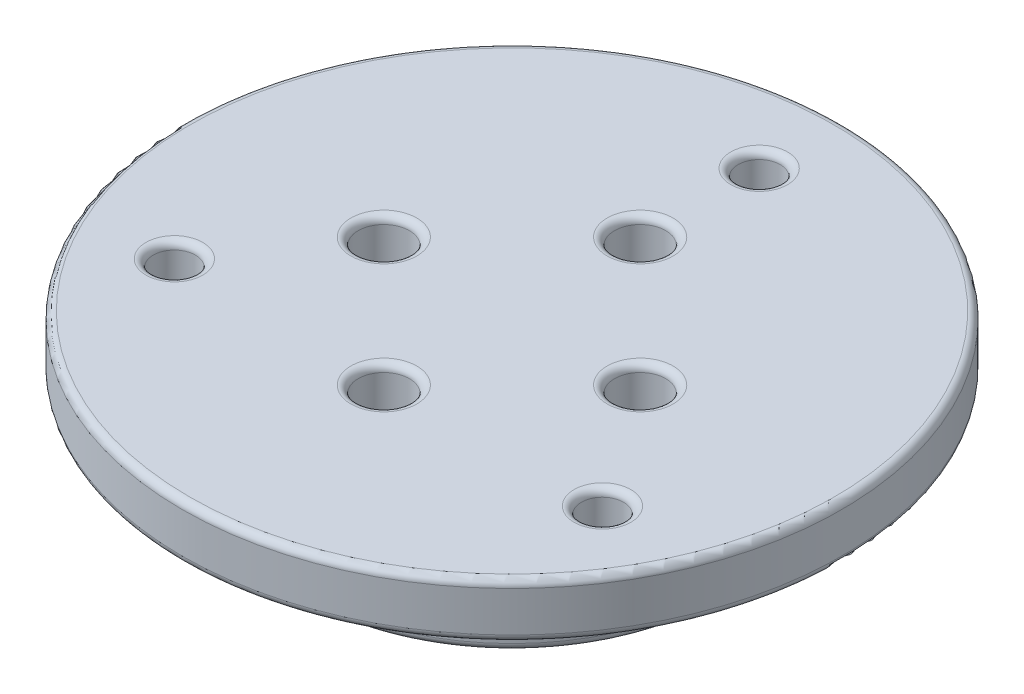
ISO-10303-21;
HEADER;
FILE_DESCRIPTION(('STEP AP214'),'2;1');
FILE_NAME('part.step','',(''),(''),'','','');
FILE_SCHEMA(('AUTOMOTIVE_DESIGN { 1 0 10303 214 1 1 1 1 }'));
ENDSEC;
DATA;
#1=APPLICATION_CONTEXT('core data for automotive mechanical design processes');
#2=APPLICATION_PROTOCOL_DEFINITION('international standard','automotive_design',2000,#1);
#3=PRODUCT_CONTEXT('',#1,'mechanical');
#4=PRODUCT('Part','Part','',(#3));
#5=PRODUCT_RELATED_PRODUCT_CATEGORY('part','',(#4));
#6=PRODUCT_DEFINITION_FORMATION('','',#4);
#7=PRODUCT_DEFINITION_CONTEXT('part definition',#1,'design');
#8=PRODUCT_DEFINITION('design','',#6,#7);
#9=PRODUCT_DEFINITION_SHAPE('','',#8);
#10=(LENGTH_UNIT() NAMED_UNIT(*) SI_UNIT(.MILLI.,.METRE.));
#11=(NAMED_UNIT(*) PLANE_ANGLE_UNIT() SI_UNIT($,.RADIAN.));
#12=(NAMED_UNIT(*) SI_UNIT($,.STERADIAN.) SOLID_ANGLE_UNIT());
#13=UNCERTAINTY_MEASURE_WITH_UNIT(LENGTH_MEASURE(1.E-05),#10,'distance_accuracy_value','');
#14=(GEOMETRIC_REPRESENTATION_CONTEXT(3) GLOBAL_UNCERTAINTY_ASSIGNED_CONTEXT((#13)) GLOBAL_UNIT_ASSIGNED_CONTEXT((#10,
#11,#12)) REPRESENTATION_CONTEXT('',''));
#15=CARTESIAN_POINT('',(0.,0.,0.));
#16=DIRECTION('',(0.,0.,1.));
#17=DIRECTION('',(1.,0.,0.));
#18=AXIS2_PLACEMENT_3D('',#15,#16,#17);
#19=CARTESIAN_POINT('',(0.,0.,0.));
#20=DIRECTION('',(0.,-1.,0.));
#21=DIRECTION('',(0.,0.,-1.));
#22=AXIS2_PLACEMENT_3D('',#19,#20,#21);
#23=PLANE('',#22);
#24=CARTESIAN_POINT('',(0.,0.,0.));
#25=DIRECTION('',(0.,-1.,0.));
#26=DIRECTION('',(0.,0.,-1.));
#27=AXIS2_PLACEMENT_3D('',#24,#25,#26);
#28=CIRCLE('',#27,11.1);
#29=CARTESIAN_POINT('',(0.,0.,-11.1));
#30=VERTEX_POINT('',#29);
#31=EDGE_CURVE('E136',#30,#30,#28,.T.);
#32=ORIENTED_EDGE('',*,*,#31,.T.);
#33=EDGE_LOOP('',(#32));
#34=FACE_BOUND('',#33,.T.);
#35=CARTESIAN_POINT('',(7.,0.,0.));
#36=DIRECTION('',(0.,-1.,0.));
#37=DIRECTION('',(0.,0.,-1.));
#38=AXIS2_PLACEMENT_3D('',#35,#36,#37);
#39=CIRCLE('',#38,1.8);
#40=CARTESIAN_POINT('',(7.,0.,-1.8));
#41=VERTEX_POINT('',#40);
#42=EDGE_CURVE('E139',#41,#41,#39,.F.);
#43=ORIENTED_EDGE('',*,*,#42,.T.);
#44=EDGE_LOOP('',(#43));
#45=FACE_BOUND('',#44,.T.);
#46=CARTESIAN_POINT('',(0.,0.,-7.));
#47=DIRECTION('',(0.,-1.,0.));
#48=DIRECTION('',(0.,0.,-1.));
#49=AXIS2_PLACEMENT_3D('',#46,#47,#48);
#50=CIRCLE('',#49,1.8);
#51=CARTESIAN_POINT('',(0.,0.,-8.8));
#52=VERTEX_POINT('',#51);
#53=EDGE_CURVE('E142',#52,#52,#50,.F.);
#54=ORIENTED_EDGE('',*,*,#53,.T.);
#55=EDGE_LOOP('',(#54));
#56=FACE_BOUND('',#55,.T.);
#57=CARTESIAN_POINT('',(0.,0.,7.));
#58=DIRECTION('',(0.,-1.,0.));
#59=DIRECTION('',(0.,0.,-1.));
#60=AXIS2_PLACEMENT_3D('',#57,#58,#59);
#61=CIRCLE('',#60,1.8);
#62=CARTESIAN_POINT('',(0.,0.,5.2));
#63=VERTEX_POINT('',#62);
#64=EDGE_CURVE('E145',#63,#63,#61,.F.);
#65=ORIENTED_EDGE('',*,*,#64,.T.);
#66=EDGE_LOOP('',(#65));
#67=FACE_BOUND('',#66,.T.);
#68=CARTESIAN_POINT('',(-7.,0.,0.));
#69=DIRECTION('',(0.,-1.,0.));
#70=DIRECTION('',(0.,0.,-1.));
#71=AXIS2_PLACEMENT_3D('',#68,#69,#70);
#72=CIRCLE('',#71,1.8);
#73=CARTESIAN_POINT('',(-7.,0.,-1.8));
#74=VERTEX_POINT('',#73);
#75=EDGE_CURVE('E148',#74,#74,#72,.F.);
#76=ORIENTED_EDGE('',*,*,#75,.T.);
#77=EDGE_LOOP('',(#76));
#78=FACE_BOUND('',#77,.T.);
#79=ADVANCED_FACE('F35',(#34,#45,#56,#67,#78),#23,.T.);
#80=CARTESIAN_POINT('',(0.,0.,0.));
#81=DIRECTION('',(0.,-1.,0.));
#82=DIRECTION('',(0.,0.,-1.));
#83=AXIS2_PLACEMENT_3D('',#80,#81,#82);
#84=CYLINDRICAL_SURFACE('',#83,11.5);
#85=CARTESIAN_POINT('',(0.,0.4,0.));
#86=DIRECTION('',(0.,-1.,0.));
#87=DIRECTION('',(0.,0.,-1.));
#88=AXIS2_PLACEMENT_3D('',#85,#86,#87);
#89=CIRCLE('',#88,11.5);
#90=CARTESIAN_POINT('',(0.,0.4,-11.5));
#91=VERTEX_POINT('',#90);
#92=EDGE_CURVE('E130',#91,#91,#89,.F.);
#93=ORIENTED_EDGE('',*,*,#92,.T.);
#94=EDGE_LOOP('',(#93));
#95=FACE_BOUND('',#94,.T.);
#96=CARTESIAN_POINT('',(0.,4.6,0.));
#97=DIRECTION('',(0.,-1.,0.));
#98=DIRECTION('',(0.,0.,-1.));
#99=AXIS2_PLACEMENT_3D('',#96,#97,#98);
#100=CIRCLE('',#99,11.5);
#101=CARTESIAN_POINT('',(0.,4.6,-11.5));
#102=VERTEX_POINT('',#101);
#103=EDGE_CURVE('E133',#102,#102,#100,.T.);
#104=ORIENTED_EDGE('',*,*,#103,.T.);
#105=EDGE_LOOP('',(#104));
#106=FACE_BOUND('',#105,.T.);
#107=ADVANCED_FACE('F171',(#95,#106),#84,.T.);
#108=CARTESIAN_POINT('',(11.5,5.,0.));
#109=DIRECTION('',(0.,-1.,0.));
#110=DIRECTION('',(0.,0.,-1.));
#111=AXIS2_PLACEMENT_3D('',#108,#109,#110);
#112=PLANE('',#111);
#113=CARTESIAN_POINT('',(0.,5.,0.));
#114=DIRECTION('',(0.,-1.,0.));
#115=DIRECTION('',(0.,0.,-1.));
#116=AXIS2_PLACEMENT_3D('',#113,#114,#115);
#117=CIRCLE('',#116,11.9);
#118=CARTESIAN_POINT('',(0.,5.,-11.9));
#119=VERTEX_POINT('',#118);
#120=EDGE_CURVE('E91',#119,#119,#117,.F.);
#121=ORIENTED_EDGE('',*,*,#120,.T.);
#122=EDGE_LOOP('',(#121));
#123=FACE_BOUND('',#122,.T.);
#124=CARTESIAN_POINT('',(0.,5.,0.));
#125=DIRECTION('',(0.,-1.,0.));
#126=DIRECTION('',(0.,0.,-1.));
#127=AXIS2_PLACEMENT_3D('',#124,#125,#126);
#128=CIRCLE('',#127,17.6);
#129=CARTESIAN_POINT('',(0.,5.,-17.6));
#130=VERTEX_POINT('',#129);
#131=EDGE_CURVE('E94',#130,#130,#128,.T.);
#132=ORIENTED_EDGE('',*,*,#131,.T.);
#133=EDGE_LOOP('',(#132));
#134=FACE_BOUND('',#133,.T.);
#135=CARTESIAN_POINT('',(-11.6913429510899,5.,6.75000000000001));
#136=DIRECTION('',(0.,-1.,0.));
#137=DIRECTION('',(0.,0.,-1.));
#138=AXIS2_PLACEMENT_3D('',#135,#136,#137);
#139=CIRCLE('',#138,1.55);
#140=CARTESIAN_POINT('',(-11.6913429510899,5.,5.20000000000001));
#141=VERTEX_POINT('',#140);
#142=EDGE_CURVE('E97',#141,#141,#139,.F.);
#143=ORIENTED_EDGE('',*,*,#142,.T.);
#144=EDGE_LOOP('',(#143));
#145=FACE_BOUND('',#144,.T.);
#146=CARTESIAN_POINT('',(11.6913429510899,5.,6.75));
#147=DIRECTION('',(0.,-1.,0.));
#148=DIRECTION('',(0.,0.,-1.));
#149=AXIS2_PLACEMENT_3D('',#146,#147,#148);
#150=CIRCLE('',#149,1.55);
#151=CARTESIAN_POINT('',(11.6913429510899,5.,5.2));
#152=VERTEX_POINT('',#151);
#153=EDGE_CURVE('E100',#152,#152,#150,.F.);
#154=ORIENTED_EDGE('',*,*,#153,.T.);
#155=EDGE_LOOP('',(#154));
#156=FACE_BOUND('',#155,.T.);
#157=CARTESIAN_POINT('',(0.,5.,-13.5));
#158=DIRECTION('',(0.,-1.,0.));
#159=DIRECTION('',(0.,0.,-1.));
#160=AXIS2_PLACEMENT_3D('',#157,#158,#159);
#161=CIRCLE('',#160,1.55);
#162=CARTESIAN_POINT('',(0.,5.,-15.05));
#163=VERTEX_POINT('',#162);
#164=EDGE_CURVE('E103',#163,#163,#161,.F.);
#165=ORIENTED_EDGE('',*,*,#164,.T.);
#166=EDGE_LOOP('',(#165));
#167=FACE_BOUND('',#166,.T.);
#168=ADVANCED_FACE('F177',(#123,#134,#145,#156,#167),#112,.T.);
#169=CARTESIAN_POINT('',(0.,0.,0.));
#170=DIRECTION('',(0.,-1.,0.));
#171=DIRECTION('',(0.,0.,-1.));
#172=AXIS2_PLACEMENT_3D('',#169,#170,#171);
#173=CYLINDRICAL_SURFACE('',#172,18.);
#174=CARTESIAN_POINT('',(0.,5.4,0.));
#175=DIRECTION('',(0.,-1.,0.));
#176=DIRECTION('',(0.,0.,-1.));
#177=AXIS2_PLACEMENT_3D('',#174,#175,#176);
#178=CIRCLE('',#177,18.);
#179=CARTESIAN_POINT('',(0.,5.4,-18.));
#180=VERTEX_POINT('',#179);
#181=EDGE_CURVE('E85',#180,#180,#178,.F.);
#182=ORIENTED_EDGE('',*,*,#181,.T.);
#183=EDGE_LOOP('',(#182));
#184=FACE_BOUND('',#183,.T.);
#185=CARTESIAN_POINT('',(0.,7.6,0.));
#186=DIRECTION('',(0.,1.,0.));
#187=DIRECTION('',(0.,0.,1.));
#188=AXIS2_PLACEMENT_3D('',#185,#186,#187);
#189=CIRCLE('',#188,18.);
#190=CARTESIAN_POINT('',(0.,7.6,18.));
#191=VERTEX_POINT('',#190);
#192=EDGE_CURVE('E88',#191,#191,#189,.F.);
#193=ORIENTED_EDGE('',*,*,#192,.T.);
#194=EDGE_LOOP('',(#193));
#195=FACE_BOUND('',#194,.T.);
#196=ADVANCED_FACE('F267',(#184,#195),#173,.T.);
#197=CARTESIAN_POINT('',(18.,8.,0.));
#198=DIRECTION('',(0.,1.,0.));
#199=DIRECTION('',(0.,0.,1.));
#200=AXIS2_PLACEMENT_3D('',#197,#198,#199);
#201=PLANE('',#200);
#202=CARTESIAN_POINT('',(0.,8.,0.));
#203=DIRECTION('',(0.,1.,0.));
#204=DIRECTION('',(0.,0.,1.));
#205=AXIS2_PLACEMENT_3D('',#202,#203,#204);
#206=CIRCLE('',#205,17.6);
#207=CARTESIAN_POINT('',(0.,8.,17.6));
#208=VERTEX_POINT('',#207);
#209=EDGE_CURVE('E10',#208,#208,#206,.T.);
#210=ORIENTED_EDGE('',*,*,#209,.T.);
#211=EDGE_LOOP('',(#210));
#212=FACE_BOUND('',#211,.T.);
#213=CARTESIAN_POINT('',(7.,8.,0.));
#214=DIRECTION('',(0.,1.,0.));
#215=DIRECTION('',(0.,0.,1.));
#216=AXIS2_PLACEMENT_3D('',#213,#214,#215);
#217=CIRCLE('',#216,1.8);
#218=CARTESIAN_POINT('',(7.,8.,1.8));
#219=VERTEX_POINT('',#218);
#220=EDGE_CURVE('E42',#219,#219,#217,.F.);
#221=ORIENTED_EDGE('',*,*,#220,.T.);
#222=EDGE_LOOP('',(#221));
#223=FACE_BOUND('',#222,.T.);
#224=CARTESIAN_POINT('',(-11.6913429510899,8.,6.75000000000001));
#225=DIRECTION('',(0.,1.,0.));
#226=DIRECTION('',(0.,0.,1.));
#227=AXIS2_PLACEMENT_3D('',#224,#225,#226);
#228=CIRCLE('',#227,1.55);
#229=CARTESIAN_POINT('',(-11.6913429510899,8.,8.30000000000001));
#230=VERTEX_POINT('',#229);
#231=EDGE_CURVE('E46',#230,#230,#228,.F.);
#232=ORIENTED_EDGE('',*,*,#231,.T.);
#233=EDGE_LOOP('',(#232));
#234=FACE_BOUND('',#233,.T.);
#235=CARTESIAN_POINT('',(11.6913429510899,8.,6.75));
#236=DIRECTION('',(0.,1.,0.));
#237=DIRECTION('',(0.,0.,1.));
#238=AXIS2_PLACEMENT_3D('',#235,#236,#237);
#239=CIRCLE('',#238,1.55);
#240=CARTESIAN_POINT('',(11.6913429510899,8.,8.3));
#241=VERTEX_POINT('',#240);
#242=EDGE_CURVE('E50',#241,#241,#239,.F.);
#243=ORIENTED_EDGE('',*,*,#242,.T.);
#244=EDGE_LOOP('',(#243));
#245=FACE_BOUND('',#244,.T.);
#246=CARTESIAN_POINT('',(0.,8.,-7.));
#247=DIRECTION('',(0.,1.,0.));
#248=DIRECTION('',(0.,0.,1.));
#249=AXIS2_PLACEMENT_3D('',#246,#247,#248);
#250=CIRCLE('',#249,1.8);
#251=CARTESIAN_POINT('',(0.,8.,-5.2));
#252=VERTEX_POINT('',#251);
#253=EDGE_CURVE('E55',#252,#252,#250,.F.);
#254=ORIENTED_EDGE('',*,*,#253,.T.);
#255=EDGE_LOOP('',(#254));
#256=FACE_BOUND('',#255,.T.);
#257=CARTESIAN_POINT('',(0.,8.,7.));
#258=DIRECTION('',(0.,1.,0.));
#259=DIRECTION('',(0.,0.,1.));
#260=AXIS2_PLACEMENT_3D('',#257,#258,#259);
#261=CIRCLE('',#260,1.8);
#262=CARTESIAN_POINT('',(0.,8.,8.8));
#263=VERTEX_POINT('',#262);
#264=EDGE_CURVE('E58',#263,#263,#261,.F.);
#265=ORIENTED_EDGE('',*,*,#264,.T.);
#266=EDGE_LOOP('',(#265));
#267=FACE_BOUND('',#266,.T.);
#268=CARTESIAN_POINT('',(-7.,8.,0.));
#269=DIRECTION('',(0.,1.,0.));
#270=DIRECTION('',(0.,0.,1.));
#271=AXIS2_PLACEMENT_3D('',#268,#269,#270);
#272=CIRCLE('',#271,1.8);
#273=CARTESIAN_POINT('',(-7.,8.,1.8));
#274=VERTEX_POINT('',#273);
#275=EDGE_CURVE('E61',#274,#274,#272,.F.);
#276=ORIENTED_EDGE('',*,*,#275,.T.);
#277=EDGE_LOOP('',(#276));
#278=FACE_BOUND('',#277,.T.);
#279=CARTESIAN_POINT('',(0.,8.,-13.5));
#280=DIRECTION('',(0.,1.,0.));
#281=DIRECTION('',(0.,0.,1.));
#282=AXIS2_PLACEMENT_3D('',#279,#280,#281);
#283=CIRCLE('',#282,1.55);
#284=CARTESIAN_POINT('',(0.,8.,-11.95));
#285=VERTEX_POINT('',#284);
#286=EDGE_CURVE('E64',#285,#285,#283,.F.);
#287=ORIENTED_EDGE('',*,*,#286,.T.);
#288=EDGE_LOOP('',(#287));
#289=FACE_BOUND('',#288,.T.);
#290=ADVANCED_FACE('F259',(#212,#223,#234,#245,#256,#267,#278,#289),#201,.T.);
#291=CARTESIAN_POINT('',(7.,0.,0.));
#292=DIRECTION('',(0.,1.,0.));
#293=DIRECTION('',(0.,0.,1.));
#294=AXIS2_PLACEMENT_3D('',#291,#292,#293);
#295=CYLINDRICAL_SURFACE('',#294,1.4);
#296=CARTESIAN_POINT('',(7.,0.4,0.));
#297=DIRECTION('',(0.,-1.,0.));
#298=DIRECTION('',(0.,0.,-1.));
#299=AXIS2_PLACEMENT_3D('',#296,#297,#298);
#300=CIRCLE('',#299,1.4);
#301=CARTESIAN_POINT('',(7.,0.4,-1.4));
#302=VERTEX_POINT('',#301);
#303=EDGE_CURVE('E124',#302,#302,#300,.T.);
#304=ORIENTED_EDGE('',*,*,#303,.T.);
#305=EDGE_LOOP('',(#304));
#306=FACE_BOUND('',#305,.T.);
#307=CARTESIAN_POINT('',(7.,7.6,0.));
#308=DIRECTION('',(0.,1.,0.));
#309=DIRECTION('',(0.,0.,1.));
#310=AXIS2_PLACEMENT_3D('',#307,#308,#309);
#311=CIRCLE('',#310,1.4);
#312=CARTESIAN_POINT('',(7.,7.6,1.4));
#313=VERTEX_POINT('',#312);
#314=EDGE_CURVE('E127',#313,#313,#311,.T.);
#315=ORIENTED_EDGE('',*,*,#314,.T.);
#316=EDGE_LOOP('',(#315));
#317=FACE_BOUND('',#316,.T.);
#318=ADVANCED_FACE('F256',(#306,#317),#295,.F.);
#319=CARTESIAN_POINT('',(-11.6913429510899,0.,6.75000000000001));
#320=DIRECTION('',(0.,1.,0.));
#321=DIRECTION('',(0.,0.,1.));
#322=AXIS2_PLACEMENT_3D('',#319,#320,#321);
#323=CYLINDRICAL_SURFACE('',#322,1.15);
#324=CARTESIAN_POINT('',(-11.6913429510899,5.4,6.75000000000001));
#325=DIRECTION('',(0.,-1.,0.));
#326=DIRECTION('',(0.,0.,-1.));
#327=AXIS2_PLACEMENT_3D('',#324,#325,#326);
#328=CIRCLE('',#327,1.15);
#329=CARTESIAN_POINT('',(-11.6913429510899,5.4,5.60000000000001));
#330=VERTEX_POINT('',#329);
#331=EDGE_CURVE('E79',#330,#330,#328,.T.);
#332=ORIENTED_EDGE('',*,*,#331,.T.);
#333=EDGE_LOOP('',(#332));
#334=FACE_BOUND('',#333,.T.);
#335=CARTESIAN_POINT('',(-11.6913429510899,7.6,6.75000000000001));
#336=DIRECTION('',(0.,1.,0.));
#337=DIRECTION('',(0.,0.,1.));
#338=AXIS2_PLACEMENT_3D('',#335,#336,#337);
#339=CIRCLE('',#338,1.15);
#340=CARTESIAN_POINT('',(-11.6913429510899,7.6,7.90000000000001));
#341=VERTEX_POINT('',#340);
#342=EDGE_CURVE('E82',#341,#341,#339,.T.);
#343=ORIENTED_EDGE('',*,*,#342,.T.);
#344=EDGE_LOOP('',(#343));
#345=FACE_BOUND('',#344,.T.);
#346=ADVANCED_FACE('F253',(#334,#345),#323,.F.);
#347=CARTESIAN_POINT('',(11.6913429510899,0.,6.75));
#348=DIRECTION('',(0.,1.,0.));
#349=DIRECTION('',(0.,0.,1.));
#350=AXIS2_PLACEMENT_3D('',#347,#348,#349);
#351=CYLINDRICAL_SURFACE('',#350,1.15);
#352=CARTESIAN_POINT('',(11.6913429510899,5.4,6.75));
#353=DIRECTION('',(0.,-1.,0.));
#354=DIRECTION('',(0.,0.,-1.));
#355=AXIS2_PLACEMENT_3D('',#352,#353,#354);
#356=CIRCLE('',#355,1.15);
#357=CARTESIAN_POINT('',(11.6913429510899,5.4,5.6));
#358=VERTEX_POINT('',#357);
#359=EDGE_CURVE('E73',#358,#358,#356,.T.);
#360=ORIENTED_EDGE('',*,*,#359,.T.);
#361=EDGE_LOOP('',(#360));
#362=FACE_BOUND('',#361,.T.);
#363=CARTESIAN_POINT('',(11.6913429510899,7.6,6.75));
#364=DIRECTION('',(0.,1.,0.));
#365=DIRECTION('',(0.,0.,1.));
#366=AXIS2_PLACEMENT_3D('',#363,#364,#365);
#367=CIRCLE('',#366,1.15);
#368=CARTESIAN_POINT('',(11.6913429510899,7.6,7.9));
#369=VERTEX_POINT('',#368);
#370=EDGE_CURVE('E76',#369,#369,#367,.T.);
#371=ORIENTED_EDGE('',*,*,#370,.T.);
#372=EDGE_LOOP('',(#371));
#373=FACE_BOUND('',#372,.T.);
#374=ADVANCED_FACE('F208',(#362,#373),#351,.F.);
#375=CARTESIAN_POINT('',(0.,0.,-7.));
#376=DIRECTION('',(0.,1.,0.));
#377=DIRECTION('',(0.,0.,1.));
#378=AXIS2_PLACEMENT_3D('',#375,#376,#377);
#379=CYLINDRICAL_SURFACE('',#378,1.4);
#380=CARTESIAN_POINT('',(0.,0.4,-7.));
#381=DIRECTION('',(0.,-1.,0.));
#382=DIRECTION('',(0.,0.,-1.));
#383=AXIS2_PLACEMENT_3D('',#380,#381,#382);
#384=CIRCLE('',#383,1.4);
#385=CARTESIAN_POINT('',(0.,0.4,-8.4));
#386=VERTEX_POINT('',#385);
#387=EDGE_CURVE('E118',#386,#386,#384,.T.);
#388=ORIENTED_EDGE('',*,*,#387,.T.);
#389=EDGE_LOOP('',(#388));
#390=FACE_BOUND('',#389,.T.);
#391=CARTESIAN_POINT('',(0.,7.6,-7.));
#392=DIRECTION('',(0.,1.,0.));
#393=DIRECTION('',(0.,0.,1.));
#394=AXIS2_PLACEMENT_3D('',#391,#392,#393);
#395=CIRCLE('',#394,1.4);
#396=CARTESIAN_POINT('',(0.,7.6,-5.6));
#397=VERTEX_POINT('',#396);
#398=EDGE_CURVE('E121',#397,#397,#395,.T.);
#399=ORIENTED_EDGE('',*,*,#398,.T.);
#400=EDGE_LOOP('',(#399));
#401=FACE_BOUND('',#400,.T.);
#402=ADVANCED_FACE('F204',(#390,#401),#379,.F.);
#403=CARTESIAN_POINT('',(0.,0.,7.));
#404=DIRECTION('',(0.,1.,0.));
#405=DIRECTION('',(0.,0.,1.));
#406=AXIS2_PLACEMENT_3D('',#403,#404,#405);
#407=CYLINDRICAL_SURFACE('',#406,1.4);
#408=CARTESIAN_POINT('',(0.,0.4,7.));
#409=DIRECTION('',(0.,-1.,0.));
#410=DIRECTION('',(0.,0.,-1.));
#411=AXIS2_PLACEMENT_3D('',#408,#409,#410);
#412=CIRCLE('',#411,1.4);
#413=CARTESIAN_POINT('',(0.,0.4,5.6));
#414=VERTEX_POINT('',#413);
#415=EDGE_CURVE('E112',#414,#414,#412,.T.);
#416=ORIENTED_EDGE('',*,*,#415,.T.);
#417=EDGE_LOOP('',(#416));
#418=FACE_BOUND('',#417,.T.);
#419=CARTESIAN_POINT('',(0.,7.6,7.));
#420=DIRECTION('',(0.,1.,0.));
#421=DIRECTION('',(0.,0.,1.));
#422=AXIS2_PLACEMENT_3D('',#419,#420,#421);
#423=CIRCLE('',#422,1.4);
#424=CARTESIAN_POINT('',(0.,7.6,8.4));
#425=VERTEX_POINT('',#424);
#426=EDGE_CURVE('E115',#425,#425,#423,.T.);
#427=ORIENTED_EDGE('',*,*,#426,.T.);
#428=EDGE_LOOP('',(#427));
#429=FACE_BOUND('',#428,.T.);
#430=ADVANCED_FACE('F207',(#418,#429),#407,.F.);
#431=CARTESIAN_POINT('',(-7.,0.,0.));
#432=DIRECTION('',(0.,1.,0.));
#433=DIRECTION('',(0.,0.,1.));
#434=AXIS2_PLACEMENT_3D('',#431,#432,#433);
#435=CYLINDRICAL_SURFACE('',#434,1.4);
#436=CARTESIAN_POINT('',(-7.,0.4,0.));
#437=DIRECTION('',(0.,-1.,0.));
#438=DIRECTION('',(0.,0.,-1.));
#439=AXIS2_PLACEMENT_3D('',#436,#437,#438);
#440=CIRCLE('',#439,1.4);
#441=CARTESIAN_POINT('',(-7.,0.4,-1.4));
#442=VERTEX_POINT('',#441);
#443=EDGE_CURVE('E106',#442,#442,#440,.T.);
#444=ORIENTED_EDGE('',*,*,#443,.T.);
#445=EDGE_LOOP('',(#444));
#446=FACE_BOUND('',#445,.T.);
#447=CARTESIAN_POINT('',(-7.,7.6,0.));
#448=DIRECTION('',(0.,1.,0.));
#449=DIRECTION('',(0.,0.,1.));
#450=AXIS2_PLACEMENT_3D('',#447,#448,#449);
#451=CIRCLE('',#450,1.4);
#452=CARTESIAN_POINT('',(-7.,7.6,1.4));
#453=VERTEX_POINT('',#452);
#454=EDGE_CURVE('E109',#453,#453,#451,.T.);
#455=ORIENTED_EDGE('',*,*,#454,.T.);
#456=EDGE_LOOP('',(#455));
#457=FACE_BOUND('',#456,.T.);
#458=ADVANCED_FACE('F240',(#446,#457),#435,.F.);
#459=CARTESIAN_POINT('',(0.,0.,-13.5));
#460=DIRECTION('',(0.,1.,0.));
#461=DIRECTION('',(0.,0.,1.));
#462=AXIS2_PLACEMENT_3D('',#459,#460,#461);
#463=CYLINDRICAL_SURFACE('',#462,1.15);
#464=CARTESIAN_POINT('',(0.,5.4,-13.5));
#465=DIRECTION('',(0.,-1.,0.));
#466=DIRECTION('',(0.,0.,-1.));
#467=AXIS2_PLACEMENT_3D('',#464,#465,#466);
#468=CIRCLE('',#467,1.15);
#469=CARTESIAN_POINT('',(0.,5.4,-14.65));
#470=VERTEX_POINT('',#469);
#471=EDGE_CURVE('E67',#470,#470,#468,.T.);
#472=ORIENTED_EDGE('',*,*,#471,.T.);
#473=EDGE_LOOP('',(#472));
#474=FACE_BOUND('',#473,.T.);
#475=CARTESIAN_POINT('',(0.,7.6,-13.5));
#476=DIRECTION('',(0.,1.,0.));
#477=DIRECTION('',(0.,0.,1.));
#478=AXIS2_PLACEMENT_3D('',#475,#476,#477);
#479=CIRCLE('',#478,1.15);
#480=CARTESIAN_POINT('',(0.,7.6,-12.35));
#481=VERTEX_POINT('',#480);
#482=EDGE_CURVE('E70',#481,#481,#479,.T.);
#483=ORIENTED_EDGE('',*,*,#482,.T.);
#484=EDGE_LOOP('',(#483));
#485=FACE_BOUND('',#484,.T.);
#486=ADVANCED_FACE('F187',(#474,#485),#463,.F.);
#487=CARTESIAN_POINT('',(0.,0.4,0.));
#488=DIRECTION('',(0.,-1.,0.));
#489=DIRECTION('',(0.,0.,-1.));
#490=AXIS2_PLACEMENT_3D('',#487,#488,#489);
#491=TOROIDAL_SURFACE('',#490,11.1,0.4);
#492=ORIENTED_EDGE('',*,*,#92,.F.);
#493=EDGE_LOOP('',(#492));
#494=FACE_BOUND('',#493,.T.);
#495=ORIENTED_EDGE('',*,*,#31,.F.);
#496=EDGE_LOOP('',(#495));
#497=FACE_BOUND('',#496,.T.);
#498=ADVANCED_FACE('F183',(#494,#497),#491,.T.);
#499=CARTESIAN_POINT('',(7.,0.4,0.));
#500=DIRECTION('',(0.,-1.,0.));
#501=DIRECTION('',(0.,0.,-1.));
#502=AXIS2_PLACEMENT_3D('',#499,#500,#501);
#503=TOROIDAL_SURFACE('',#502,1.8,0.4);
#504=ORIENTED_EDGE('',*,*,#303,.F.);
#505=EDGE_LOOP('',(#504));
#506=FACE_BOUND('',#505,.T.);
#507=ORIENTED_EDGE('',*,*,#42,.F.);
#508=EDGE_LOOP('',(#507));
#509=FACE_BOUND('',#508,.T.);
#510=ADVANCED_FACE('F186',(#506,#509),#503,.T.);
#511=CARTESIAN_POINT('',(0.,0.4,-7.));
#512=DIRECTION('',(0.,-1.,0.));
#513=DIRECTION('',(0.,0.,-1.));
#514=AXIS2_PLACEMENT_3D('',#511,#512,#513);
#515=TOROIDAL_SURFACE('',#514,1.8,0.4);
#516=ORIENTED_EDGE('',*,*,#387,.F.);
#517=EDGE_LOOP('',(#516));
#518=FACE_BOUND('',#517,.T.);
#519=ORIENTED_EDGE('',*,*,#53,.F.);
#520=EDGE_LOOP('',(#519));
#521=FACE_BOUND('',#520,.T.);
#522=ADVANCED_FACE('F166',(#518,#521),#515,.T.);
#523=CARTESIAN_POINT('',(0.,0.4,7.));
#524=DIRECTION('',(0.,-1.,0.));
#525=DIRECTION('',(0.,0.,-1.));
#526=AXIS2_PLACEMENT_3D('',#523,#524,#525);
#527=TOROIDAL_SURFACE('',#526,1.8,0.4);
#528=ORIENTED_EDGE('',*,*,#415,.F.);
#529=EDGE_LOOP('',(#528));
#530=FACE_BOUND('',#529,.T.);
#531=ORIENTED_EDGE('',*,*,#64,.F.);
#532=EDGE_LOOP('',(#531));
#533=FACE_BOUND('',#532,.T.);
#534=ADVANCED_FACE('F156',(#530,#533),#527,.T.);
#535=CARTESIAN_POINT('',(-7.,0.4,0.));
#536=DIRECTION('',(0.,-1.,0.));
#537=DIRECTION('',(0.,0.,-1.));
#538=AXIS2_PLACEMENT_3D('',#535,#536,#537);
#539=TOROIDAL_SURFACE('',#538,1.8,0.4);
#540=ORIENTED_EDGE('',*,*,#443,.F.);
#541=EDGE_LOOP('',(#540));
#542=FACE_BOUND('',#541,.T.);
#543=ORIENTED_EDGE('',*,*,#75,.F.);
#544=EDGE_LOOP('',(#543));
#545=FACE_BOUND('',#544,.T.);
#546=ADVANCED_FACE('F153',(#542,#545),#539,.T.);
#547=CARTESIAN_POINT('',(0.,4.6,0.));
#548=DIRECTION('',(0.,-1.,0.));
#549=DIRECTION('',(0.,0.,-1.));
#550=AXIS2_PLACEMENT_3D('',#547,#548,#549);
#551=TOROIDAL_SURFACE('',#550,11.9,0.4);
#552=ORIENTED_EDGE('',*,*,#120,.F.);
#553=EDGE_LOOP('',(#552));
#554=FACE_BOUND('',#553,.T.);
#555=ORIENTED_EDGE('',*,*,#103,.F.);
#556=EDGE_LOOP('',(#555));
#557=FACE_BOUND('',#556,.T.);
#558=ADVANCED_FACE('F155',(#554,#557),#551,.F.);
#559=CARTESIAN_POINT('',(0.,5.4,0.));
#560=DIRECTION('',(0.,-1.,0.));
#561=DIRECTION('',(0.,0.,-1.));
#562=AXIS2_PLACEMENT_3D('',#559,#560,#561);
#563=TOROIDAL_SURFACE('',#562,17.6,0.4);
#564=ORIENTED_EDGE('',*,*,#181,.F.);
#565=EDGE_LOOP('',(#564));
#566=FACE_BOUND('',#565,.T.);
#567=ORIENTED_EDGE('',*,*,#131,.F.);
#568=EDGE_LOOP('',(#567));
#569=FACE_BOUND('',#568,.T.);
#570=ADVANCED_FACE('F163',(#566,#569),#563,.T.);
#571=CARTESIAN_POINT('',(-11.6913429510899,5.4,6.75000000000001));
#572=DIRECTION('',(0.,-1.,0.));
#573=DIRECTION('',(0.,0.,-1.));
#574=AXIS2_PLACEMENT_3D('',#571,#572,#573);
#575=TOROIDAL_SURFACE('',#574,1.55,0.4);
#576=ORIENTED_EDGE('',*,*,#142,.F.);
#577=EDGE_LOOP('',(#576));
#578=FACE_BOUND('',#577,.T.);
#579=ORIENTED_EDGE('',*,*,#331,.F.);
#580=EDGE_LOOP('',(#579));
#581=FACE_BOUND('',#580,.T.);
#582=ADVANCED_FACE('F301',(#578,#581),#575,.T.);
#583=CARTESIAN_POINT('',(11.6913429510899,5.4,6.75));
#584=DIRECTION('',(0.,-1.,0.));
#585=DIRECTION('',(0.,0.,-1.));
#586=AXIS2_PLACEMENT_3D('',#583,#584,#585);
#587=TOROIDAL_SURFACE('',#586,1.55,0.4);
#588=ORIENTED_EDGE('',*,*,#153,.F.);
#589=EDGE_LOOP('',(#588));
#590=FACE_BOUND('',#589,.T.);
#591=ORIENTED_EDGE('',*,*,#359,.F.);
#592=EDGE_LOOP('',(#591));
#593=FACE_BOUND('',#592,.T.);
#594=ADVANCED_FACE('F288',(#590,#593),#587,.T.);
#595=CARTESIAN_POINT('',(0.,5.4,-13.5));
#596=DIRECTION('',(0.,-1.,0.));
#597=DIRECTION('',(0.,0.,-1.));
#598=AXIS2_PLACEMENT_3D('',#595,#596,#597);
#599=TOROIDAL_SURFACE('',#598,1.55,0.4);
#600=ORIENTED_EDGE('',*,*,#164,.F.);
#601=EDGE_LOOP('',(#600));
#602=FACE_BOUND('',#601,.T.);
#603=ORIENTED_EDGE('',*,*,#471,.F.);
#604=EDGE_LOOP('',(#603));
#605=FACE_BOUND('',#604,.T.);
#606=ADVANCED_FACE('F284',(#602,#605),#599,.T.);
#607=CARTESIAN_POINT('',(0.,7.6,0.));
#608=DIRECTION('',(0.,1.,0.));
#609=DIRECTION('',(0.,0.,1.));
#610=AXIS2_PLACEMENT_3D('',#607,#608,#609);
#611=TOROIDAL_SURFACE('',#610,17.6,0.4);
#612=ORIENTED_EDGE('',*,*,#209,.F.);
#613=EDGE_LOOP('',(#612));
#614=FACE_BOUND('',#613,.T.);
#615=ORIENTED_EDGE('',*,*,#192,.F.);
#616=EDGE_LOOP('',(#615));
#617=FACE_BOUND('',#616,.T.);
#618=ADVANCED_FACE('F287',(#614,#617),#611,.T.);
#619=CARTESIAN_POINT('',(7.,7.6,0.));
#620=DIRECTION('',(0.,1.,0.));
#621=DIRECTION('',(0.,0.,1.));
#622=AXIS2_PLACEMENT_3D('',#619,#620,#621);
#623=TOROIDAL_SURFACE('',#622,1.8,0.4);
#624=ORIENTED_EDGE('',*,*,#220,.F.);
#625=EDGE_LOOP('',(#624));
#626=FACE_BOUND('',#625,.T.);
#627=ORIENTED_EDGE('',*,*,#314,.F.);
#628=EDGE_LOOP('',(#627));
#629=FACE_BOUND('',#628,.T.);
#630=ADVANCED_FACE('F298',(#626,#629),#623,.T.);
#631=CARTESIAN_POINT('',(-11.6913429510899,7.6,6.75000000000001));
#632=DIRECTION('',(0.,1.,0.));
#633=DIRECTION('',(0.,0.,1.));
#634=AXIS2_PLACEMENT_3D('',#631,#632,#633);
#635=TOROIDAL_SURFACE('',#634,1.55,0.4);
#636=ORIENTED_EDGE('',*,*,#231,.F.);
#637=EDGE_LOOP('',(#636));
#638=FACE_BOUND('',#637,.T.);
#639=ORIENTED_EDGE('',*,*,#342,.F.);
#640=EDGE_LOOP('',(#639));
#641=FACE_BOUND('',#640,.T.);
#642=ADVANCED_FACE('F225',(#638,#641),#635,.T.);
#643=CARTESIAN_POINT('',(11.6913429510899,7.6,6.75));
#644=DIRECTION('',(0.,1.,0.));
#645=DIRECTION('',(0.,0.,1.));
#646=AXIS2_PLACEMENT_3D('',#643,#644,#645);
#647=TOROIDAL_SURFACE('',#646,1.55,0.4);
#648=ORIENTED_EDGE('',*,*,#242,.F.);
#649=EDGE_LOOP('',(#648));
#650=FACE_BOUND('',#649,.T.);
#651=ORIENTED_EDGE('',*,*,#370,.F.);
#652=EDGE_LOOP('',(#651));
#653=FACE_BOUND('',#652,.T.);
#654=ADVANCED_FACE('F215',(#650,#653),#647,.T.);
#655=CARTESIAN_POINT('',(0.,7.6,-7.));
#656=DIRECTION('',(0.,1.,0.));
#657=DIRECTION('',(0.,0.,1.));
#658=AXIS2_PLACEMENT_3D('',#655,#656,#657);
#659=TOROIDAL_SURFACE('',#658,1.8,0.4);
#660=ORIENTED_EDGE('',*,*,#253,.F.);
#661=EDGE_LOOP('',(#660));
#662=FACE_BOUND('',#661,.T.);
#663=ORIENTED_EDGE('',*,*,#398,.F.);
#664=EDGE_LOOP('',(#663));
#665=FACE_BOUND('',#664,.T.);
#666=ADVANCED_FACE('F212',(#662,#665),#659,.T.);
#667=CARTESIAN_POINT('',(0.,7.6,7.));
#668=DIRECTION('',(0.,1.,0.));
#669=DIRECTION('',(0.,0.,1.));
#670=AXIS2_PLACEMENT_3D('',#667,#668,#669);
#671=TOROIDAL_SURFACE('',#670,1.8,0.4);
#672=ORIENTED_EDGE('',*,*,#264,.F.);
#673=EDGE_LOOP('',(#672));
#674=FACE_BOUND('',#673,.T.);
#675=ORIENTED_EDGE('',*,*,#426,.F.);
#676=EDGE_LOOP('',(#675));
#677=FACE_BOUND('',#676,.T.);
#678=ADVANCED_FACE('F214',(#674,#677),#671,.T.);
#679=CARTESIAN_POINT('',(-7.,7.6,0.));
#680=DIRECTION('',(0.,1.,0.));
#681=DIRECTION('',(0.,0.,1.));
#682=AXIS2_PLACEMENT_3D('',#679,#680,#681);
#683=TOROIDAL_SURFACE('',#682,1.8,0.4);
#684=ORIENTED_EDGE('',*,*,#275,.F.);
#685=EDGE_LOOP('',(#684));
#686=FACE_BOUND('',#685,.T.);
#687=ORIENTED_EDGE('',*,*,#454,.F.);
#688=EDGE_LOOP('',(#687));
#689=FACE_BOUND('',#688,.T.);
#690=ADVANCED_FACE('F222',(#686,#689),#683,.T.);
#691=CARTESIAN_POINT('',(0.,7.6,-13.5));
#692=DIRECTION('',(0.,1.,0.));
#693=DIRECTION('',(0.,0.,1.));
#694=AXIS2_PLACEMENT_3D('',#691,#692,#693);
#695=TOROIDAL_SURFACE('',#694,1.55,0.4);
#696=ORIENTED_EDGE('',*,*,#286,.F.);
#697=EDGE_LOOP('',(#696));
#698=FACE_BOUND('',#697,.T.);
#699=ORIENTED_EDGE('',*,*,#482,.F.);
#700=EDGE_LOOP('',(#699));
#701=FACE_BOUND('',#700,.T.);
#702=ADVANCED_FACE('F37',(#698,#701),#695,.T.);
#703=CLOSED_SHELL('',(#79,#107,#168,#196,#290,#318,#346,#374,#402,#430,#458,#486,#498,#510,#522,
#534,#546,#558,#570,#582,#594,#606,#618,#630,#642,#654,#666,#678,#690,#702));
#704=MANIFOLD_SOLID_BREP('B2',#703);
#705=ADVANCED_BREP_SHAPE_REPRESENTATION('',(#18,#704),#14);
#706=SHAPE_DEFINITION_REPRESENTATION(#9,#705);
ENDSEC;
END-ISO-10303-21;
